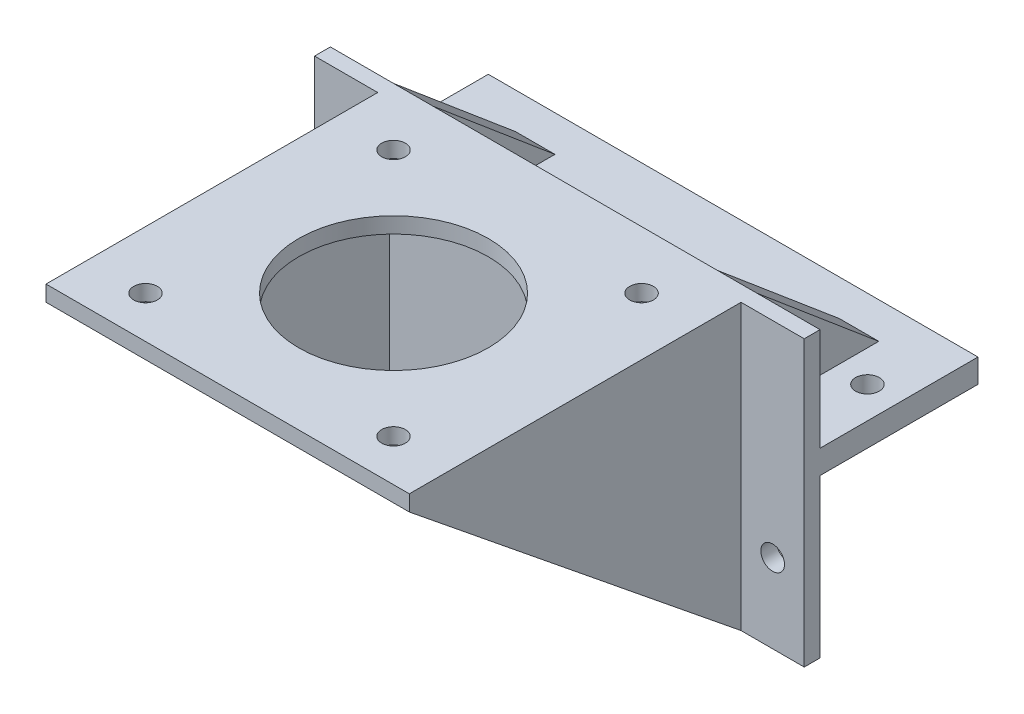
ISO-10303-21;
HEADER;
FILE_DESCRIPTION(('STEP AP214'),'2;1');
FILE_NAME('part.step','',(''),(''),'','','');
FILE_SCHEMA(('AUTOMOTIVE_DESIGN { 1 0 10303 214 1 1 1 1 }'));
ENDSEC;
DATA;
#1=APPLICATION_CONTEXT('core data for automotive mechanical design processes');
#2=APPLICATION_PROTOCOL_DEFINITION('international standard','automotive_design',2000,#1);
#3=PRODUCT_CONTEXT('',#1,'mechanical');
#4=PRODUCT('Part','Part','',(#3));
#5=PRODUCT_RELATED_PRODUCT_CATEGORY('part','',(#4));
#6=PRODUCT_DEFINITION_FORMATION('','',#4);
#7=PRODUCT_DEFINITION_CONTEXT('part definition',#1,'design');
#8=PRODUCT_DEFINITION('design','',#6,#7);
#9=PRODUCT_DEFINITION_SHAPE('','',#8);
#10=(LENGTH_UNIT() NAMED_UNIT(*) SI_UNIT(.MILLI.,.METRE.));
#11=(NAMED_UNIT(*) PLANE_ANGLE_UNIT() SI_UNIT($,.RADIAN.));
#12=(NAMED_UNIT(*) SI_UNIT($,.STERADIAN.) SOLID_ANGLE_UNIT());
#13=UNCERTAINTY_MEASURE_WITH_UNIT(LENGTH_MEASURE(1.E-05),#10,'distance_accuracy_value','');
#14=(GEOMETRIC_REPRESENTATION_CONTEXT(3) GLOBAL_UNCERTAINTY_ASSIGNED_CONTEXT((#13)) GLOBAL_UNIT_ASSIGNED_CONTEXT((#10,
#11,#12)) REPRESENTATION_CONTEXT('',''));
#15=CARTESIAN_POINT('',(0.,0.,0.));
#16=DIRECTION('',(0.,0.,1.));
#17=DIRECTION('',(1.,0.,0.));
#18=AXIS2_PLACEMENT_3D('',#15,#16,#17);
#19=CARTESIAN_POINT('',(-23.,19.,44.));
#20=DIRECTION('',(1.,0.,0.));
#21=DIRECTION('',(0.,0.,-1.));
#22=AXIS2_PLACEMENT_3D('',#19,#20,#21);
#23=PLANE('',#22);
#24=DIRECTION('',(0.,0.,-1.));
#25=VECTOR('',#24,1.);
#26=CARTESIAN_POINT('',(-23.,7.,44.));
#27=LINE('',#26,#25);
#28=CARTESIAN_POINT('',(-23.,7.,0.));
#29=VERTEX_POINT('',#28);
#30=CARTESIAN_POINT('',(-23.,7.,-15.4375));
#31=VERTEX_POINT('',#30);
#32=EDGE_CURVE('P0_E207',#29,#31,#27,.T.);
#33=ORIENTED_EDGE('',*,*,#32,.F.);
#34=DIRECTION('',(0.,-1.,0.));
#35=VECTOR('',#34,1.);
#36=CARTESIAN_POINT('',(-23.,12.,0.));
#37=LINE('',#36,#35);
#38=CARTESIAN_POINT('',(-23.,20.,0.));
#39=VERTEX_POINT('',#38);
#40=EDGE_CURVE('P0_E375',#39,#29,#37,.T.);
#41=ORIENTED_EDGE('',*,*,#40,.F.);
#42=DIRECTION('',(0.,0.64413574578278,0.764911198117051));
#43=VECTOR('',#42,1.);
#44=CARTESIAN_POINT('',(-23.,12.,-9.5));
#45=LINE('',#44,#43);
#46=EDGE_CURVE('P0_E268',#31,#39,#45,.T.);
#47=ORIENTED_EDGE('',*,*,#46,.F.);
#48=EDGE_LOOP('',(#33,#41,#47));
#49=FACE_BOUND('',#48,.T.);
#50=ADVANCED_FACE('P0_F38',(#49),#23,.F.);
#51=CARTESIAN_POINT('',(23.,19.,44.));
#52=DIRECTION('',(-1.,0.,0.));
#53=DIRECTION('',(0.,0.,1.));
#54=AXIS2_PLACEMENT_3D('',#51,#52,#53);
#55=PLANE('',#54);
#56=DIRECTION('',(0.,0.,1.));
#57=VECTOR('',#56,1.);
#58=CARTESIAN_POINT('',(23.,7.,44.));
#59=LINE('',#58,#57);
#60=CARTESIAN_POINT('',(23.,7.,-15.4375));
#61=VERTEX_POINT('',#60);
#62=CARTESIAN_POINT('',(23.,7.,0.));
#63=VERTEX_POINT('',#62);
#64=EDGE_CURVE('P0_E219',#61,#63,#59,.T.);
#65=ORIENTED_EDGE('',*,*,#64,.F.);
#66=DIRECTION('',(0.,0.64413574578278,0.764911198117051));
#67=VECTOR('',#66,1.);
#68=CARTESIAN_POINT('',(23.,12.,-9.5));
#69=LINE('',#68,#67);
#70=CARTESIAN_POINT('',(23.,20.,0.));
#71=VERTEX_POINT('',#70);
#72=EDGE_CURVE('P0_E261',#61,#71,#69,.T.);
#73=ORIENTED_EDGE('',*,*,#72,.T.);
#74=DIRECTION('',(0.,-1.,0.));
#75=VECTOR('',#74,1.);
#76=CARTESIAN_POINT('',(23.,12.,0.));
#77=LINE('',#76,#75);
#78=EDGE_CURVE('P0_E361',#71,#63,#77,.T.);
#79=ORIENTED_EDGE('',*,*,#78,.T.);
#80=EDGE_LOOP('',(#65,#73,#79));
#81=FACE_BOUND('',#80,.T.);
#82=ADVANCED_FACE('P0_F401',(#81),#55,.F.);
#83=CARTESIAN_POINT('',(0.,0.,0.));
#84=DIRECTION('',(0.,0.,1.));
#85=DIRECTION('',(1.,0.,0.));
#86=AXIS2_PLACEMENT_3D('',#83,#84,#85);
#87=PLANE('',#86);
#88=CARTESIAN_POINT('',(-27.,-6.000008,0.));
#89=DIRECTION('',(0.,0.,1.));
#90=DIRECTION('',(1.,0.,0.));
#91=AXIS2_PLACEMENT_3D('',#88,#89,#90);
#92=CIRCLE('',#91,1.5);
#93=CARTESIAN_POINT('',(-25.5,-6.000008,0.));
#94=VERTEX_POINT('',#93);
#95=EDGE_CURVE('P0_E46',#94,#94,#92,.T.);
#96=ORIENTED_EDGE('',*,*,#95,.T.);
#97=EDGE_LOOP('',(#96));
#98=FACE_BOUND('',#97,.T.);
#99=CARTESIAN_POINT('',(27.,-6.000008,0.));
#100=DIRECTION('',(0.,0.,1.));
#101=DIRECTION('',(1.,0.,0.));
#102=AXIS2_PLACEMENT_3D('',#99,#100,#101);
#103=CIRCLE('',#102,1.5);
#104=CARTESIAN_POINT('',(28.5,-6.000008,0.));
#105=VERTEX_POINT('',#104);
#106=EDGE_CURVE('P0_E378',#105,#105,#103,.T.);
#107=ORIENTED_EDGE('',*,*,#106,.T.);
#108=EDGE_LOOP('',(#107));
#109=FACE_BOUND('',#108,.T.);
#110=DIRECTION('',(1.,0.,0.));
#111=VECTOR('',#110,1.);
#112=CARTESIAN_POINT('',(18.,4.,0.));
#113=LINE('',#112,#111);
#114=CARTESIAN_POINT('',(-31.,4.,0.));
#115=VERTEX_POINT('',#114);
#116=CARTESIAN_POINT('',(31.,4.,0.));
#117=VERTEX_POINT('',#116);
#118=EDGE_CURVE('P0_E364',#115,#117,#113,.T.);
#119=ORIENTED_EDGE('',*,*,#118,.T.);
#120=DIRECTION('',(0.,-1.,0.));
#121=VECTOR('',#120,1.);
#122=CARTESIAN_POINT('',(31.,0.,0.));
#123=LINE('',#122,#121);
#124=CARTESIAN_POINT('',(31.,-16.000008,0.));
#125=VERTEX_POINT('',#124);
#126=EDGE_CURVE('P0_E205',#117,#125,#123,.T.);
#127=ORIENTED_EDGE('',*,*,#126,.T.);
#128=DIRECTION('',(-1.,0.,0.));
#129=VECTOR('',#128,1.);
#130=CARTESIAN_POINT('',(0.,-16.000008,0.));
#131=LINE('',#130,#129);
#132=CARTESIAN_POINT('',(-31.,-16.000008,0.));
#133=VERTEX_POINT('',#132);
#134=EDGE_CURVE('P0_E355',#125,#133,#131,.T.);
#135=ORIENTED_EDGE('',*,*,#134,.T.);
#136=DIRECTION('',(0.,-1.,0.));
#137=VECTOR('',#136,1.);
#138=CARTESIAN_POINT('',(-31.,0.,0.));
#139=LINE('',#138,#137);
#140=EDGE_CURVE('P0_E351',#115,#133,#139,.T.);
#141=ORIENTED_EDGE('',*,*,#140,.F.);
#142=EDGE_LOOP('',(#119,#127,#135,#141));
#143=FACE_BOUND('',#142,.T.);
#144=ADVANCED_FACE('P0_F40',(#98,#109,#143),#87,.F.);
#145=DIRECTION('',(1.,0.,0.));
#146=VECTOR('',#145,1.);
#147=CARTESIAN_POINT('',(31.,7.,0.));
#148=LINE('',#147,#146);
#149=CARTESIAN_POINT('',(-31.,7.,0.));
#150=VERTEX_POINT('',#149);
#151=EDGE_CURVE('P0_E201',#150,#29,#148,.T.);
#152=ORIENTED_EDGE('',*,*,#151,.F.);
#153=CARTESIAN_POINT('',(-31.,20.,0.));
#154=VERTEX_POINT('',#153);
#155=EDGE_CURVE('P0_E352',#154,#150,#139,.T.);
#156=ORIENTED_EDGE('',*,*,#155,.F.);
#157=DIRECTION('',(-1.,0.,0.));
#158=VECTOR('',#157,1.);
#159=CARTESIAN_POINT('',(-31.,20.,0.));
#160=LINE('',#159,#158);
#161=EDGE_CURVE('P0_E231',#39,#154,#160,.T.);
#162=ORIENTED_EDGE('',*,*,#161,.F.);
#163=ORIENTED_EDGE('',*,*,#40,.T.);
#164=EDGE_LOOP('',(#152,#156,#162,#163));
#165=FACE_BOUND('',#164,.T.);
#166=ADVANCED_FACE('P0_F503',(#165),#87,.F.);
#167=CARTESIAN_POINT('',(-18.,7.,0.));
#168=VERTEX_POINT('',#167);
#169=CARTESIAN_POINT('',(18.,7.,0.));
#170=VERTEX_POINT('',#169);
#171=EDGE_CURVE('P0_E509',#168,#170,#148,.T.);
#172=ORIENTED_EDGE('',*,*,#171,.F.);
#173=DIRECTION('',(0.,-1.,0.));
#174=VECTOR('',#173,1.);
#175=CARTESIAN_POINT('',(-18.,12.,0.));
#176=LINE('',#175,#174);
#177=CARTESIAN_POINT('',(-18.,20.,0.));
#178=VERTEX_POINT('',#177);
#179=EDGE_CURVE('P0_E372',#178,#168,#176,.T.);
#180=ORIENTED_EDGE('',*,*,#179,.F.);
#181=DIRECTION('',(-1.,0.,0.));
#182=VECTOR('',#181,1.);
#183=CARTESIAN_POINT('',(0.,20.,0.));
#184=LINE('',#183,#182);
#185=CARTESIAN_POINT('',(18.,20.,0.));
#186=VERTEX_POINT('',#185);
#187=EDGE_CURVE('P0_E369',#186,#178,#184,.T.);
#188=ORIENTED_EDGE('',*,*,#187,.F.);
#189=DIRECTION('',(0.,-1.,0.));
#190=VECTOR('',#189,1.);
#191=CARTESIAN_POINT('',(18.,12.,0.));
#192=LINE('',#191,#190);
#193=EDGE_CURVE('P0_E366',#186,#170,#192,.T.);
#194=ORIENTED_EDGE('',*,*,#193,.T.);
#195=EDGE_LOOP('',(#172,#180,#188,#194));
#196=FACE_BOUND('',#195,.T.);
#197=ADVANCED_FACE('P0_F494',(#196),#87,.F.);
#198=CARTESIAN_POINT('',(31.,7.,0.));
#199=VERTEX_POINT('',#198);
#200=EDGE_CURVE('P0_E480',#63,#199,#148,.T.);
#201=ORIENTED_EDGE('',*,*,#200,.F.);
#202=ORIENTED_EDGE('',*,*,#78,.F.);
#203=CARTESIAN_POINT('',(31.,20.,0.));
#204=VERTEX_POINT('',#203);
#205=EDGE_CURVE('P0_E232',#204,#71,#160,.T.);
#206=ORIENTED_EDGE('',*,*,#205,.F.);
#207=EDGE_CURVE('P0_E358',#204,#199,#123,.T.);
#208=ORIENTED_EDGE('',*,*,#207,.T.);
#209=EDGE_LOOP('',(#201,#202,#206,#208));
#210=FACE_BOUND('',#209,.T.);
#211=ADVANCED_FACE('P0_F478',(#210),#87,.F.);
#212=CARTESIAN_POINT('',(18.,12.,-9.5));
#213=DIRECTION('',(0.,0.764911198117051,-0.64413574578278));
#214=DIRECTION('',(0.,0.64413574578278,0.764911198117051));
#215=AXIS2_PLACEMENT_3D('',#212,#213,#214);
#216=PLANE('',#215);
#217=ORIENTED_EDGE('',*,*,#72,.F.);
#218=DIRECTION('',(-1.,0.,0.));
#219=VECTOR('',#218,1.);
#220=CARTESIAN_POINT('',(18.,7.,-15.4375));
#221=LINE('',#220,#219);
#222=CARTESIAN_POINT('',(18.,7.,-15.4375));
#223=VERTEX_POINT('',#222);
#224=EDGE_CURVE('P0_E216',#61,#223,#221,.T.);
#225=ORIENTED_EDGE('',*,*,#224,.T.);
#226=DIRECTION('',(0.,0.64413574578278,0.764911198117051));
#227=VECTOR('',#226,1.);
#228=CARTESIAN_POINT('',(18.,12.,-9.5));
#229=LINE('',#228,#227);
#230=EDGE_CURVE('P0_E237',#223,#186,#229,.T.);
#231=ORIENTED_EDGE('',*,*,#230,.T.);
#232=EDGE_CURVE('P0_E335',#71,#186,#184,.T.);
#233=ORIENTED_EDGE('',*,*,#232,.F.);
#234=EDGE_LOOP('',(#217,#225,#231,#233));
#235=FACE_BOUND('',#234,.T.);
#236=ADVANCED_FACE('P0_F486',(#235),#216,.T.);
#237=CARTESIAN_POINT('',(18.,12.,-9.5));
#238=DIRECTION('',(1.,0.,0.));
#239=DIRECTION('',(0.,1.,0.));
#240=AXIS2_PLACEMENT_3D('',#237,#238,#239);
#241=PLANE('',#240);
#242=DIRECTION('',(0.,0.,-1.));
#243=VECTOR('',#242,1.);
#244=CARTESIAN_POINT('',(18.,7.,-9.5));
#245=LINE('',#244,#243);
#246=EDGE_CURVE('P0_E214',#170,#223,#245,.T.);
#247=ORIENTED_EDGE('',*,*,#246,.F.);
#248=ORIENTED_EDGE('',*,*,#193,.F.);
#249=ORIENTED_EDGE('',*,*,#230,.F.);
#250=EDGE_LOOP('',(#247,#248,#249));
#251=FACE_BOUND('',#250,.T.);
#252=ADVANCED_FACE('P0_F557',(#251),#241,.F.);
#253=CARTESIAN_POINT('',(-18.,12.,-9.5));
#254=DIRECTION('',(0.,-0.764911198117051,0.64413574578278));
#255=DIRECTION('',(0.,-0.64413574578278,-0.764911198117051));
#256=AXIS2_PLACEMENT_3D('',#253,#254,#255);
#257=PLANE('',#256);
#258=DIRECTION('',(1.,0.,0.));
#259=VECTOR('',#258,1.);
#260=CARTESIAN_POINT('',(-18.,7.,-15.4375));
#261=LINE('',#260,#259);
#262=CARTESIAN_POINT('',(-18.,7.,-15.4375));
#263=VERTEX_POINT('',#262);
#264=EDGE_CURVE('P0_E53',#31,#263,#261,.T.);
#265=ORIENTED_EDGE('',*,*,#264,.F.);
#266=ORIENTED_EDGE('',*,*,#46,.T.);
#267=DIRECTION('',(-1.,0.,0.));
#268=VECTOR('',#267,1.);
#269=CARTESIAN_POINT('',(-18.,20.,0.));
#270=LINE('',#269,#268);
#271=EDGE_CURVE('P0_E332',#178,#39,#270,.T.);
#272=ORIENTED_EDGE('',*,*,#271,.F.);
#273=DIRECTION('',(0.,0.64413574578278,0.764911198117051));
#274=VECTOR('',#273,1.);
#275=CARTESIAN_POINT('',(-18.,12.,-9.5));
#276=LINE('',#275,#274);
#277=EDGE_CURVE('P0_E235',#263,#178,#276,.T.);
#278=ORIENTED_EDGE('',*,*,#277,.F.);
#279=EDGE_LOOP('',(#265,#266,#272,#278));
#280=FACE_BOUND('',#279,.T.);
#281=ADVANCED_FACE('P0_F422',(#280),#257,.F.);
#282=CARTESIAN_POINT('',(-18.,12.,-9.5));
#283=DIRECTION('',(1.,0.,0.));
#284=DIRECTION('',(0.,1.,0.));
#285=AXIS2_PLACEMENT_3D('',#282,#283,#284);
#286=PLANE('',#285);
#287=ORIENTED_EDGE('',*,*,#179,.T.);
#288=DIRECTION('',(0.,0.,-1.));
#289=VECTOR('',#288,1.);
#290=CARTESIAN_POINT('',(-18.,7.,-9.5));
#291=LINE('',#290,#289);
#292=EDGE_CURVE('P0_E11',#168,#263,#291,.T.);
#293=ORIENTED_EDGE('',*,*,#292,.T.);
#294=ORIENTED_EDGE('',*,*,#277,.T.);
#295=EDGE_LOOP('',(#287,#293,#294));
#296=FACE_BOUND('',#295,.T.);
#297=ADVANCED_FACE('P0_F414',(#296),#286,.T.);
#298=DIRECTION('',(0.,0.,-1.));
#299=VECTOR('',#298,1.);
#300=CARTESIAN_POINT('',(-23.,20.,44.));
#301=LINE('',#300,#299);
#302=CARTESIAN_POINT('',(-23.,20.,44.));
#303=VERTEX_POINT('',#302);
#304=CARTESIAN_POINT('',(-23.,20.,2.));
#305=VERTEX_POINT('',#304);
#306=EDGE_CURVE('P0_E330',#303,#305,#301,.T.);
#307=ORIENTED_EDGE('',*,*,#306,.T.);
#308=DIRECTION('',(0.,-1.,0.));
#309=VECTOR('',#308,1.);
#310=CARTESIAN_POINT('',(-23.,19.,2.));
#311=LINE('',#310,#309);
#312=CARTESIAN_POINT('',(-23.,-16.000008,2.));
#313=VERTEX_POINT('',#312);
#314=EDGE_CURVE('P0_E60',#305,#313,#311,.T.);
#315=ORIENTED_EDGE('',*,*,#314,.T.);
#316=DIRECTION('',(0.,-0.629198318104348,-0.777244798306595));
#317=VECTOR('',#316,1.);
#318=CARTESIAN_POINT('',(-23.,0.999996,23.));
#319=LINE('',#318,#317);
#320=CARTESIAN_POINT('',(-23.,18.,44.));
#321=VERTEX_POINT('',#320);
#322=EDGE_CURVE('P0_E266',#313,#321,#319,.F.);
#323=ORIENTED_EDGE('',*,*,#322,.T.);
#324=DIRECTION('',(0.,-1.,0.));
#325=VECTOR('',#324,1.);
#326=CARTESIAN_POINT('',(-23.,19.,44.));
#327=LINE('',#326,#325);
#328=EDGE_CURVE('P0_E263',#303,#321,#327,.T.);
#329=ORIENTED_EDGE('',*,*,#328,.F.);
#330=EDGE_LOOP('',(#307,#315,#323,#329));
#331=FACE_BOUND('',#330,.T.);
#332=ADVANCED_FACE('P0_F404',(#331),#23,.F.);
#333=DIRECTION('',(0.,1.,0.));
#334=VECTOR('',#333,1.);
#335=CARTESIAN_POINT('',(23.,19.,2.));
#336=LINE('',#335,#334);
#337=CARTESIAN_POINT('',(23.,-16.000008,2.));
#338=VERTEX_POINT('',#337);
#339=CARTESIAN_POINT('',(23.,20.,2.));
#340=VERTEX_POINT('',#339);
#341=EDGE_CURVE('P0_E313',#338,#340,#336,.T.);
#342=ORIENTED_EDGE('',*,*,#341,.T.);
#343=DIRECTION('',(0.,0.,-1.));
#344=VECTOR('',#343,1.);
#345=CARTESIAN_POINT('',(23.,20.,44.));
#346=LINE('',#345,#344);
#347=CARTESIAN_POINT('',(23.,20.,44.));
#348=VERTEX_POINT('',#347);
#349=EDGE_CURVE('P0_E324',#348,#340,#346,.T.);
#350=ORIENTED_EDGE('',*,*,#349,.F.);
#351=DIRECTION('',(0.,1.,0.));
#352=VECTOR('',#351,1.);
#353=CARTESIAN_POINT('',(23.,19.,44.));
#354=LINE('',#353,#352);
#355=CARTESIAN_POINT('',(23.,18.,44.));
#356=VERTEX_POINT('',#355);
#357=EDGE_CURVE('P0_E258',#356,#348,#354,.T.);
#358=ORIENTED_EDGE('',*,*,#357,.F.);
#359=DIRECTION('',(0.,-0.629198318104348,-0.777244798306595));
#360=VECTOR('',#359,1.);
#361=CARTESIAN_POINT('',(23.,0.999996,23.));
#362=LINE('',#361,#360);
#363=EDGE_CURVE('P0_E255',#338,#356,#362,.F.);
#364=ORIENTED_EDGE('',*,*,#363,.F.);
#365=EDGE_LOOP('',(#342,#350,#358,#364));
#366=FACE_BOUND('',#365,.T.);
#367=ADVANCED_FACE('P0_F410',(#366),#55,.F.);
#368=CARTESIAN_POINT('',(0.,20.,2.));
#369=DIRECTION('',(0.,-1.,0.));
#370=DIRECTION('',(0.,0.,-1.));
#371=AXIS2_PLACEMENT_3D('',#368,#369,#370);
#372=PLANE('',#371);
#373=ORIENTED_EDGE('',*,*,#271,.T.);
#374=ORIENTED_EDGE('',*,*,#161,.T.);
#375=DIRECTION('',(0.,0.,1.));
#376=VECTOR('',#375,1.);
#377=CARTESIAN_POINT('',(-31.,20.,0.));
#378=LINE('',#377,#376);
#379=CARTESIAN_POINT('',(-31.,20.,2.));
#380=VERTEX_POINT('',#379);
#381=EDGE_CURVE('P0_E221',#154,#380,#378,.T.);
#382=ORIENTED_EDGE('',*,*,#381,.T.);
#383=DIRECTION('',(1.,0.,0.));
#384=VECTOR('',#383,1.);
#385=CARTESIAN_POINT('',(-31.,20.,2.));
#386=LINE('',#385,#384);
#387=EDGE_CURVE('P0_E225',#380,#305,#386,.T.);
#388=ORIENTED_EDGE('',*,*,#387,.T.);
#389=ORIENTED_EDGE('',*,*,#306,.F.);
#390=DIRECTION('',(-1.,0.,0.));
#391=VECTOR('',#390,1.);
#392=CARTESIAN_POINT('',(0.,20.,44.));
#393=LINE('',#392,#391);
#394=EDGE_CURVE('P0_E327',#348,#303,#393,.T.);
#395=ORIENTED_EDGE('',*,*,#394,.F.);
#396=ORIENTED_EDGE('',*,*,#349,.T.);
#397=CARTESIAN_POINT('',(31.,20.,2.));
#398=VERTEX_POINT('',#397);
#399=EDGE_CURVE('P0_E224',#340,#398,#386,.T.);
#400=ORIENTED_EDGE('',*,*,#399,.T.);
#401=DIRECTION('',(0.,0.,-1.));
#402=VECTOR('',#401,1.);
#403=CARTESIAN_POINT('',(31.,20.,0.));
#404=LINE('',#403,#402);
#405=EDGE_CURVE('P0_E228',#398,#204,#404,.T.);
#406=ORIENTED_EDGE('',*,*,#405,.T.);
#407=ORIENTED_EDGE('',*,*,#205,.T.);
#408=ORIENTED_EDGE('',*,*,#232,.T.);
#409=ORIENTED_EDGE('',*,*,#187,.T.);
#410=EDGE_LOOP('',(#373,#374,#382,#388,#389,#395,#396,#400,#406,#407,#408,#409));
#411=FACE_BOUND('',#410,.T.);
#412=CARTESIAN_POINT('',(15.7,20.,7.3));
#413=DIRECTION('',(0.,-1.,0.));
#414=DIRECTION('',(0.,0.,-1.));
#415=AXIS2_PLACEMENT_3D('',#412,#413,#414);
#416=CIRCLE('',#415,1.5);
#417=CARTESIAN_POINT('',(15.7,20.,5.8));
#418=VERTEX_POINT('',#417);
#419=EDGE_CURVE('P0_E336',#418,#418,#416,.T.);
#420=ORIENTED_EDGE('',*,*,#419,.T.);
#421=EDGE_LOOP('',(#420));
#422=FACE_BOUND('',#421,.T.);
#423=CARTESIAN_POINT('',(-15.7,20.,7.3));
#424=DIRECTION('',(0.,-1.,0.));
#425=DIRECTION('',(0.,0.,-1.));
#426=AXIS2_PLACEMENT_3D('',#423,#424,#425);
#427=CIRCLE('',#426,1.5);
#428=CARTESIAN_POINT('',(-15.7,20.,5.8));
#429=VERTEX_POINT('',#428);
#430=EDGE_CURVE('P0_E339',#429,#429,#427,.T.);
#431=ORIENTED_EDGE('',*,*,#430,.T.);
#432=EDGE_LOOP('',(#431));
#433=FACE_BOUND('',#432,.T.);
#434=CARTESIAN_POINT('',(-15.7,20.,38.7));
#435=DIRECTION('',(0.,-1.,0.));
#436=DIRECTION('',(0.,0.,-1.));
#437=AXIS2_PLACEMENT_3D('',#434,#435,#436);
#438=CIRCLE('',#437,1.5);
#439=CARTESIAN_POINT('',(-15.7,20.,37.2));
#440=VERTEX_POINT('',#439);
#441=EDGE_CURVE('P0_E342',#440,#440,#438,.T.);
#442=ORIENTED_EDGE('',*,*,#441,.T.);
#443=EDGE_LOOP('',(#442));
#444=FACE_BOUND('',#443,.T.);
#445=CARTESIAN_POINT('',(15.7,20.,38.7));
#446=DIRECTION('',(0.,-1.,0.));
#447=DIRECTION('',(0.,0.,-1.));
#448=AXIS2_PLACEMENT_3D('',#445,#446,#447);
#449=CIRCLE('',#448,1.5);
#450=CARTESIAN_POINT('',(15.7,20.,37.2));
#451=VERTEX_POINT('',#450);
#452=EDGE_CURVE('P0_E345',#451,#451,#449,.T.);
#453=ORIENTED_EDGE('',*,*,#452,.T.);
#454=EDGE_LOOP('',(#453));
#455=FACE_BOUND('',#454,.T.);
#456=CARTESIAN_POINT('',(0.,20.,23.));
#457=DIRECTION('',(0.,-1.,0.));
#458=DIRECTION('',(0.,0.,-1.));
#459=AXIS2_PLACEMENT_3D('',#456,#457,#458);
#460=CIRCLE('',#459,12.);
#461=CARTESIAN_POINT('',(0.,20.,11.));
#462=VERTEX_POINT('',#461);
#463=EDGE_CURVE('P0_E348',#462,#462,#460,.T.);
#464=ORIENTED_EDGE('',*,*,#463,.T.);
#465=EDGE_LOOP('',(#464));
#466=FACE_BOUND('',#465,.T.);
#467=ADVANCED_FACE('P0_F420',(#411,#422,#433,#444,#455,#466),#372,.F.);
#468=CARTESIAN_POINT('',(0.,0.,2.));
#469=DIRECTION('',(0.,0.,1.));
#470=DIRECTION('',(1.,0.,0.));
#471=AXIS2_PLACEMENT_3D('',#468,#469,#470);
#472=PLANE('',#471);
#473=CARTESIAN_POINT('',(-27.,-6.000008,2.));
#474=DIRECTION('',(0.,0.,1.));
#475=DIRECTION('',(1.,0.,0.));
#476=AXIS2_PLACEMENT_3D('',#473,#474,#475);
#477=CIRCLE('',#476,1.5);
#478=CARTESIAN_POINT('',(-25.5,-6.000008,2.));
#479=VERTEX_POINT('',#478);
#480=EDGE_CURVE('P0_E321',#479,#479,#477,.T.);
#481=ORIENTED_EDGE('',*,*,#480,.F.);
#482=EDGE_LOOP('',(#481));
#483=FACE_BOUND('',#482,.T.);
#484=ORIENTED_EDGE('',*,*,#314,.F.);
#485=ORIENTED_EDGE('',*,*,#387,.F.);
#486=DIRECTION('',(0.,-1.,0.));
#487=VECTOR('',#486,1.);
#488=CARTESIAN_POINT('',(-31.,0.,2.));
#489=LINE('',#488,#487);
#490=CARTESIAN_POINT('',(-31.,-16.000008,2.));
#491=VERTEX_POINT('',#490);
#492=EDGE_CURVE('P0_E318',#380,#491,#489,.T.);
#493=ORIENTED_EDGE('',*,*,#492,.T.);
#494=DIRECTION('',(-1.,0.,0.));
#495=VECTOR('',#494,1.);
#496=CARTESIAN_POINT('',(0.,-16.000008,2.));
#497=LINE('',#496,#495);
#498=EDGE_CURVE('P0_E315',#313,#491,#497,.T.);
#499=ORIENTED_EDGE('',*,*,#498,.F.);
#500=EDGE_LOOP('',(#484,#485,#493,#499));
#501=FACE_BOUND('',#500,.T.);
#502=ADVANCED_FACE('P0_F430',(#483,#501),#472,.T.);
#503=DIRECTION('',(0.,-1.,0.));
#504=VECTOR('',#503,1.);
#505=CARTESIAN_POINT('',(31.,0.,2.));
#506=LINE('',#505,#504);
#507=CARTESIAN_POINT('',(31.,-16.000008,2.));
#508=VERTEX_POINT('',#507);
#509=EDGE_CURVE('P0_E309',#398,#508,#506,.T.);
#510=ORIENTED_EDGE('',*,*,#509,.F.);
#511=ORIENTED_EDGE('',*,*,#399,.F.);
#512=ORIENTED_EDGE('',*,*,#341,.F.);
#513=EDGE_CURVE('P0_E312',#508,#338,#497,.T.);
#514=ORIENTED_EDGE('',*,*,#513,.F.);
#515=EDGE_LOOP('',(#510,#511,#512,#514));
#516=FACE_BOUND('',#515,.T.);
#517=CARTESIAN_POINT('',(27.,-6.000008,2.));
#518=DIRECTION('',(0.,0.,1.));
#519=DIRECTION('',(1.,0.,0.));
#520=AXIS2_PLACEMENT_3D('',#517,#518,#519);
#521=CIRCLE('',#520,1.5);
#522=CARTESIAN_POINT('',(28.5,-6.000008,2.));
#523=VERTEX_POINT('',#522);
#524=EDGE_CURVE('P0_E306',#523,#523,#521,.T.);
#525=ORIENTED_EDGE('',*,*,#524,.F.);
#526=EDGE_LOOP('',(#525));
#527=FACE_BOUND('',#526,.T.);
#528=ADVANCED_FACE('P0_F471',(#516,#527),#472,.T.);
#529=CARTESIAN_POINT('',(0.,18.,44.));
#530=DIRECTION('',(0.,1.,0.));
#531=DIRECTION('',(-1.,0.,0.));
#532=AXIS2_PLACEMENT_3D('',#529,#530,#531);
#533=PLANE('',#532);
#534=CARTESIAN_POINT('',(0.,18.,23.));
#535=DIRECTION('',(0.,-1.,0.));
#536=DIRECTION('',(1.,0.,0.));
#537=AXIS2_PLACEMENT_3D('',#534,#535,#536);
#538=CIRCLE('',#537,12.);
#539=CARTESIAN_POINT('',(12.,18.,23.));
#540=VERTEX_POINT('',#539);
#541=EDGE_CURVE('P0_E303',#540,#540,#538,.T.);
#542=ORIENTED_EDGE('',*,*,#541,.F.);
#543=EDGE_LOOP('',(#542));
#544=FACE_BOUND('',#543,.T.);
#545=CARTESIAN_POINT('',(15.7,18.,38.7));
#546=DIRECTION('',(0.,-1.,0.));
#547=DIRECTION('',(1.,0.,0.));
#548=AXIS2_PLACEMENT_3D('',#545,#546,#547);
#549=CIRCLE('',#548,1.5);
#550=CARTESIAN_POINT('',(17.2,18.,38.7));
#551=VERTEX_POINT('',#550);
#552=EDGE_CURVE('P0_E300',#551,#551,#549,.T.);
#553=ORIENTED_EDGE('',*,*,#552,.F.);
#554=EDGE_LOOP('',(#553));
#555=FACE_BOUND('',#554,.T.);
#556=CARTESIAN_POINT('',(-15.7,18.,38.7));
#557=DIRECTION('',(0.,-1.,0.));
#558=DIRECTION('',(1.,0.,0.));
#559=AXIS2_PLACEMENT_3D('',#556,#557,#558);
#560=CIRCLE('',#559,1.5);
#561=CARTESIAN_POINT('',(-14.2,18.,38.7));
#562=VERTEX_POINT('',#561);
#563=EDGE_CURVE('P0_E297',#562,#562,#560,.T.);
#564=ORIENTED_EDGE('',*,*,#563,.F.);
#565=EDGE_LOOP('',(#564));
#566=FACE_BOUND('',#565,.T.);
#567=CARTESIAN_POINT('',(-15.7,18.,7.3));
#568=DIRECTION('',(0.,-1.,0.));
#569=DIRECTION('',(1.,0.,0.));
#570=AXIS2_PLACEMENT_3D('',#567,#568,#569);
#571=CIRCLE('',#570,1.5);
#572=CARTESIAN_POINT('',(-14.2,18.,7.3));
#573=VERTEX_POINT('',#572);
#574=EDGE_CURVE('P0_E294',#573,#573,#571,.T.);
#575=ORIENTED_EDGE('',*,*,#574,.F.);
#576=EDGE_LOOP('',(#575));
#577=FACE_BOUND('',#576,.T.);
#578=CARTESIAN_POINT('',(15.7,18.,7.3));
#579=DIRECTION('',(0.,-1.,0.));
#580=DIRECTION('',(1.,0.,0.));
#581=AXIS2_PLACEMENT_3D('',#578,#579,#580);
#582=CIRCLE('',#581,1.5);
#583=CARTESIAN_POINT('',(17.2,18.,7.3));
#584=VERTEX_POINT('',#583);
#585=EDGE_CURVE('P0_E291',#584,#584,#582,.T.);
#586=ORIENTED_EDGE('',*,*,#585,.F.);
#587=EDGE_LOOP('',(#586));
#588=FACE_BOUND('',#587,.T.);
#589=DIRECTION('',(0.,0.,-1.));
#590=VECTOR('',#589,1.);
#591=CARTESIAN_POINT('',(21.5,18.,44.));
#592=LINE('',#591,#590);
#593=CARTESIAN_POINT('',(21.5,18.,44.));
#594=VERTEX_POINT('',#593);
#595=CARTESIAN_POINT('',(21.5,18.,2.));
#596=VERTEX_POINT('',#595);
#597=EDGE_CURVE('P0_E288',#594,#596,#592,.T.);
#598=ORIENTED_EDGE('',*,*,#597,.F.);
#599=DIRECTION('',(1.,0.,0.));
#600=VECTOR('',#599,1.);
#601=CARTESIAN_POINT('',(0.,18.,44.));
#602=LINE('',#601,#600);
#603=CARTESIAN_POINT('',(-21.5,18.,44.));
#604=VERTEX_POINT('',#603);
#605=EDGE_CURVE('P0_E285',#604,#594,#602,.T.);
#606=ORIENTED_EDGE('',*,*,#605,.F.);
#607=DIRECTION('',(0.,0.,-1.));
#608=VECTOR('',#607,1.);
#609=CARTESIAN_POINT('',(-21.5,18.,44.));
#610=LINE('',#609,#608);
#611=CARTESIAN_POINT('',(-21.5,18.,2.));
#612=VERTEX_POINT('',#611);
#613=EDGE_CURVE('P0_E283',#604,#612,#610,.T.);
#614=ORIENTED_EDGE('',*,*,#613,.T.);
#615=DIRECTION('',(1.,0.,0.));
#616=VECTOR('',#615,1.);
#617=CARTESIAN_POINT('',(0.,18.,2.));
#618=LINE('',#617,#616);
#619=EDGE_CURVE('P0_E281',#612,#596,#618,.T.);
#620=ORIENTED_EDGE('',*,*,#619,.T.);
#621=EDGE_LOOP('',(#598,#606,#614,#620));
#622=FACE_BOUND('',#621,.T.);
#623=ADVANCED_FACE('P0_F464',(#544,#555,#566,#577,#588,#622),#533,.F.);
#624=DIRECTION('',(0.,-1.,0.));
#625=VECTOR('',#624,1.);
#626=CARTESIAN_POINT('',(21.5,0.999996,2.));
#627=LINE('',#626,#625);
#628=CARTESIAN_POINT('',(21.5,-16.000008,2.));
#629=VERTEX_POINT('',#628);
#630=EDGE_CURVE('P0_E278',#596,#629,#627,.T.);
#631=ORIENTED_EDGE('',*,*,#630,.F.);
#632=ORIENTED_EDGE('',*,*,#619,.F.);
#633=DIRECTION('',(0.,-1.,0.));
#634=VECTOR('',#633,1.);
#635=CARTESIAN_POINT('',(-21.5,0.999996,2.));
#636=LINE('',#635,#634);
#637=CARTESIAN_POINT('',(-21.5,-16.000008,2.));
#638=VERTEX_POINT('',#637);
#639=EDGE_CURVE('P0_E276',#612,#638,#636,.T.);
#640=ORIENTED_EDGE('',*,*,#639,.T.);
#641=EDGE_CURVE('P0_E275',#629,#638,#497,.T.);
#642=ORIENTED_EDGE('',*,*,#641,.F.);
#643=EDGE_LOOP('',(#631,#632,#640,#642));
#644=FACE_BOUND('',#643,.T.);
#645=ADVANCED_FACE('P0_F454',(#644),#472,.T.);
#646=CARTESIAN_POINT('',(31.,0.,2.));
#647=DIRECTION('',(1.,0.,0.));
#648=DIRECTION('',(0.,1.,0.));
#649=AXIS2_PLACEMENT_3D('',#646,#647,#648);
#650=PLANE('',#649);
#651=ORIENTED_EDGE('',*,*,#207,.F.);
#652=ORIENTED_EDGE('',*,*,#405,.F.);
#653=ORIENTED_EDGE('',*,*,#509,.T.);
#654=DIRECTION('',(0.,0.,-1.));
#655=VECTOR('',#654,1.);
#656=CARTESIAN_POINT('',(31.,-16.000008,2.));
#657=LINE('',#656,#655);
#658=EDGE_CURVE('P0_E273',#508,#125,#657,.T.);
#659=ORIENTED_EDGE('',*,*,#658,.T.);
#660=ORIENTED_EDGE('',*,*,#126,.F.);
#661=DIRECTION('',(0.,0.,1.));
#662=VECTOR('',#661,1.);
#663=CARTESIAN_POINT('',(31.,4.,-20.));
#664=LINE('',#663,#662);
#665=CARTESIAN_POINT('',(31.,4.,-20.));
#666=VERTEX_POINT('',#665);
#667=EDGE_CURVE('P0_E185',#666,#117,#664,.T.);
#668=ORIENTED_EDGE('',*,*,#667,.F.);
#669=DIRECTION('',(0.,-1.,0.));
#670=VECTOR('',#669,1.);
#671=CARTESIAN_POINT('',(31.,4.,-20.));
#672=LINE('',#671,#670);
#673=CARTESIAN_POINT('',(31.,7.,-20.));
#674=VERTEX_POINT('',#673);
#675=EDGE_CURVE('P0_E192',#674,#666,#672,.T.);
#676=ORIENTED_EDGE('',*,*,#675,.F.);
#677=DIRECTION('',(0.,0.,1.));
#678=VECTOR('',#677,1.);
#679=CARTESIAN_POINT('',(31.,7.,-20.));
#680=LINE('',#679,#678);
#681=EDGE_CURVE('P0_E475',#674,#199,#680,.T.);
#682=ORIENTED_EDGE('',*,*,#681,.T.);
#683=EDGE_LOOP('',(#651,#652,#653,#659,#660,#668,#676,#682));
#684=FACE_BOUND('',#683,.T.);
#685=ADVANCED_FACE('P0_F203',(#684),#650,.T.);
#686=CARTESIAN_POINT('',(-31.,0.,2.));
#687=DIRECTION('',(1.,0.,0.));
#688=DIRECTION('',(0.,1.,0.));
#689=AXIS2_PLACEMENT_3D('',#686,#687,#688);
#690=PLANE('',#689);
#691=ORIENTED_EDGE('',*,*,#492,.F.);
#692=ORIENTED_EDGE('',*,*,#381,.F.);
#693=ORIENTED_EDGE('',*,*,#155,.T.);
#694=DIRECTION('',(0.,0.,1.));
#695=VECTOR('',#694,1.);
#696=CARTESIAN_POINT('',(-31.,7.,-20.));
#697=LINE('',#696,#695);
#698=CARTESIAN_POINT('',(-31.,7.,-20.));
#699=VERTEX_POINT('',#698);
#700=EDGE_CURVE('P0_E209',#699,#150,#697,.T.);
#701=ORIENTED_EDGE('',*,*,#700,.F.);
#702=DIRECTION('',(0.,1.,0.));
#703=VECTOR('',#702,1.);
#704=CARTESIAN_POINT('',(-31.,4.,-20.));
#705=LINE('',#704,#703);
#706=CARTESIAN_POINT('',(-31.,4.,-20.));
#707=VERTEX_POINT('',#706);
#708=EDGE_CURVE('P0_E191',#707,#699,#705,.T.);
#709=ORIENTED_EDGE('',*,*,#708,.F.);
#710=DIRECTION('',(0.,0.,1.));
#711=VECTOR('',#710,1.);
#712=CARTESIAN_POINT('',(-31.,4.,-20.));
#713=LINE('',#712,#711);
#714=EDGE_CURVE('P0_E188',#707,#115,#713,.T.);
#715=ORIENTED_EDGE('',*,*,#714,.T.);
#716=ORIENTED_EDGE('',*,*,#140,.T.);
#717=DIRECTION('',(0.,0.,-1.));
#718=VECTOR('',#717,1.);
#719=CARTESIAN_POINT('',(-31.,-16.000008,2.));
#720=LINE('',#719,#718);
#721=EDGE_CURVE('P0_E270',#491,#133,#720,.T.);
#722=ORIENTED_EDGE('',*,*,#721,.F.);
#723=EDGE_LOOP('',(#691,#692,#693,#701,#709,#715,#716,#722));
#724=FACE_BOUND('',#723,.T.);
#725=ADVANCED_FACE('P0_F434',(#724),#690,.F.);
#726=CARTESIAN_POINT('',(0.,0.,44.));
#727=DIRECTION('',(0.,0.,1.));
#728=DIRECTION('',(1.,0.,0.));
#729=AXIS2_PLACEMENT_3D('',#726,#727,#728);
#730=PLANE('',#729);
#731=ORIENTED_EDGE('',*,*,#394,.T.);
#732=ORIENTED_EDGE('',*,*,#328,.T.);
#733=EDGE_CURVE('P0_E254',#321,#604,#602,.T.);
#734=ORIENTED_EDGE('',*,*,#733,.T.);
#735=ORIENTED_EDGE('',*,*,#605,.T.);
#736=DIRECTION('',(1.,0.,0.));
#737=VECTOR('',#736,1.);
#738=CARTESIAN_POINT('',(21.5,18.,44.));
#739=LINE('',#738,#737);
#740=EDGE_CURVE('P0_E251',#594,#356,#739,.T.);
#741=ORIENTED_EDGE('',*,*,#740,.T.);
#742=ORIENTED_EDGE('',*,*,#357,.T.);
#743=EDGE_LOOP('',(#731,#732,#734,#735,#741,#742));
#744=FACE_BOUND('',#743,.T.);
#745=ADVANCED_FACE('P0_F467',(#744),#730,.T.);
#746=CARTESIAN_POINT('',(0.,43.,23.));
#747=DIRECTION('',(0.,-1.,0.));
#748=DIRECTION('',(1.,0.,0.));
#749=AXIS2_PLACEMENT_3D('',#746,#747,#748);
#750=CYLINDRICAL_SURFACE('',#749,12.);
#751=ORIENTED_EDGE('',*,*,#541,.T.);
#752=EDGE_LOOP('',(#751));
#753=FACE_BOUND('',#752,.T.);
#754=ORIENTED_EDGE('',*,*,#463,.F.);
#755=EDGE_LOOP('',(#754));
#756=FACE_BOUND('',#755,.T.);
#757=ADVANCED_FACE('P0_F791',(#753,#756),#750,.F.);
#758=CARTESIAN_POINT('',(15.7,43.,38.7));
#759=DIRECTION('',(0.,-1.,0.));
#760=DIRECTION('',(1.,0.,0.));
#761=AXIS2_PLACEMENT_3D('',#758,#759,#760);
#762=CYLINDRICAL_SURFACE('',#761,1.5);
#763=ORIENTED_EDGE('',*,*,#552,.T.);
#764=EDGE_LOOP('',(#763));
#765=FACE_BOUND('',#764,.T.);
#766=ORIENTED_EDGE('',*,*,#452,.F.);
#767=EDGE_LOOP('',(#766));
#768=FACE_BOUND('',#767,.T.);
#769=ADVANCED_FACE('P0_F782',(#765,#768),#762,.F.);
#770=CARTESIAN_POINT('',(-15.7,43.,38.7));
#771=DIRECTION('',(0.,-1.,0.));
#772=DIRECTION('',(1.,0.,0.));
#773=AXIS2_PLACEMENT_3D('',#770,#771,#772);
#774=CYLINDRICAL_SURFACE('',#773,1.5);
#775=ORIENTED_EDGE('',*,*,#563,.T.);
#776=EDGE_LOOP('',(#775));
#777=FACE_BOUND('',#776,.T.);
#778=ORIENTED_EDGE('',*,*,#441,.F.);
#779=EDGE_LOOP('',(#778));
#780=FACE_BOUND('',#779,.T.);
#781=ADVANCED_FACE('P0_F773',(#777,#780),#774,.F.);
#782=CARTESIAN_POINT('',(-15.7,43.,7.3));
#783=DIRECTION('',(0.,-1.,0.));
#784=DIRECTION('',(1.,0.,0.));
#785=AXIS2_PLACEMENT_3D('',#782,#783,#784);
#786=CYLINDRICAL_SURFACE('',#785,1.5);
#787=ORIENTED_EDGE('',*,*,#574,.T.);
#788=EDGE_LOOP('',(#787));
#789=FACE_BOUND('',#788,.T.);
#790=ORIENTED_EDGE('',*,*,#430,.F.);
#791=EDGE_LOOP('',(#790));
#792=FACE_BOUND('',#791,.T.);
#793=ADVANCED_FACE('P0_F764',(#789,#792),#786,.F.);
#794=CARTESIAN_POINT('',(15.7,43.,7.3));
#795=DIRECTION('',(0.,-1.,0.));
#796=DIRECTION('',(1.,0.,0.));
#797=AXIS2_PLACEMENT_3D('',#794,#795,#796);
#798=CYLINDRICAL_SURFACE('',#797,1.5);
#799=ORIENTED_EDGE('',*,*,#585,.T.);
#800=EDGE_LOOP('',(#799));
#801=FACE_BOUND('',#800,.T.);
#802=ORIENTED_EDGE('',*,*,#419,.F.);
#803=EDGE_LOOP('',(#802));
#804=FACE_BOUND('',#803,.T.);
#805=ADVANCED_FACE('P0_F756',(#801,#804),#798,.F.);
#806=CARTESIAN_POINT('',(0.,-16.000008,2.));
#807=DIRECTION('',(0.,-1.,0.));
#808=DIRECTION('',(0.,0.,-1.));
#809=AXIS2_PLACEMENT_3D('',#806,#807,#808);
#810=PLANE('',#809);
#811=ORIENTED_EDGE('',*,*,#134,.F.);
#812=ORIENTED_EDGE('',*,*,#658,.F.);
#813=ORIENTED_EDGE('',*,*,#513,.T.);
#814=DIRECTION('',(1.,0.,0.));
#815=VECTOR('',#814,1.);
#816=CARTESIAN_POINT('',(21.5,-16.000008,2.));
#817=LINE('',#816,#815);
#818=EDGE_CURVE('P0_E248',#629,#338,#817,.T.);
#819=ORIENTED_EDGE('',*,*,#818,.F.);
#820=ORIENTED_EDGE('',*,*,#641,.T.);
#821=DIRECTION('',(-1.,0.,0.));
#822=VECTOR('',#821,1.);
#823=CARTESIAN_POINT('',(-21.5,-16.000008,2.));
#824=LINE('',#823,#822);
#825=EDGE_CURVE('P0_E245',#638,#313,#824,.T.);
#826=ORIENTED_EDGE('',*,*,#825,.T.);
#827=ORIENTED_EDGE('',*,*,#498,.T.);
#828=ORIENTED_EDGE('',*,*,#721,.T.);
#829=EDGE_LOOP('',(#811,#812,#813,#819,#820,#826,#827,#828));
#830=FACE_BOUND('',#829,.T.);
#831=ADVANCED_FACE('P0_F438',(#830),#810,.T.);
#832=CARTESIAN_POINT('',(-21.5,0.999996,23.));
#833=DIRECTION('',(0.,-0.777244798306595,0.629198318104348));
#834=DIRECTION('',(0.,-0.629198318104348,-0.777244798306595));
#835=AXIS2_PLACEMENT_3D('',#832,#833,#834);
#836=PLANE('',#835);
#837=ORIENTED_EDGE('',*,*,#322,.F.);
#838=ORIENTED_EDGE('',*,*,#825,.F.);
#839=DIRECTION('',(0.,-0.629198318104348,-0.777244798306595));
#840=VECTOR('',#839,1.);
#841=CARTESIAN_POINT('',(-21.5,0.999996,23.));
#842=LINE('',#841,#840);
#843=EDGE_CURVE('P0_E242',#638,#604,#842,.F.);
#844=ORIENTED_EDGE('',*,*,#843,.T.);
#845=ORIENTED_EDGE('',*,*,#733,.F.);
#846=EDGE_LOOP('',(#837,#838,#844,#845));
#847=FACE_BOUND('',#846,.T.);
#848=ADVANCED_FACE('P0_F458',(#847),#836,.T.);
#849=CARTESIAN_POINT('',(-21.5,9.499998,12.5));
#850=DIRECTION('',(1.,0.,0.));
#851=DIRECTION('',(0.,0.,-1.));
#852=AXIS2_PLACEMENT_3D('',#849,#850,#851);
#853=PLANE('',#852);
#854=ORIENTED_EDGE('',*,*,#843,.F.);
#855=ORIENTED_EDGE('',*,*,#639,.F.);
#856=ORIENTED_EDGE('',*,*,#613,.F.);
#857=EDGE_LOOP('',(#854,#855,#856));
#858=FACE_BOUND('',#857,.T.);
#859=ADVANCED_FACE('P0_F462',(#858),#853,.T.);
#860=CARTESIAN_POINT('',(21.5,0.999996,23.));
#861=DIRECTION('',(0.,0.777244798306595,-0.629198318104348));
#862=DIRECTION('',(0.,0.629198318104348,0.777244798306595));
#863=AXIS2_PLACEMENT_3D('',#860,#861,#862);
#864=PLANE('',#863);
#865=ORIENTED_EDGE('',*,*,#363,.T.);
#866=ORIENTED_EDGE('',*,*,#740,.F.);
#867=DIRECTION('',(0.,-0.629198318104348,-0.777244798306595));
#868=VECTOR('',#867,1.);
#869=CARTESIAN_POINT('',(21.5,0.999996,23.));
#870=LINE('',#869,#868);
#871=EDGE_CURVE('P0_E239',#629,#594,#870,.F.);
#872=ORIENTED_EDGE('',*,*,#871,.F.);
#873=ORIENTED_EDGE('',*,*,#818,.T.);
#874=EDGE_LOOP('',(#865,#866,#872,#873));
#875=FACE_BOUND('',#874,.T.);
#876=ADVANCED_FACE('P0_F447',(#875),#864,.F.);
#877=CARTESIAN_POINT('',(21.5,9.499998,12.5));
#878=DIRECTION('',(1.,0.,0.));
#879=DIRECTION('',(0.,0.,-1.));
#880=AXIS2_PLACEMENT_3D('',#877,#878,#879);
#881=PLANE('',#880);
#882=ORIENTED_EDGE('',*,*,#871,.T.);
#883=ORIENTED_EDGE('',*,*,#597,.T.);
#884=ORIENTED_EDGE('',*,*,#630,.T.);
#885=EDGE_LOOP('',(#882,#883,#884));
#886=FACE_BOUND('',#885,.T.);
#887=ADVANCED_FACE('P0_F397',(#886),#881,.F.);
#888=CARTESIAN_POINT('',(27.,-6.000008,-23.));
#889=DIRECTION('',(0.,0.,1.));
#890=DIRECTION('',(1.,0.,0.));
#891=AXIS2_PLACEMENT_3D('',#888,#889,#890);
#892=CYLINDRICAL_SURFACE('',#891,1.5);
#893=ORIENTED_EDGE('',*,*,#524,.T.);
#894=EDGE_LOOP('',(#893));
#895=FACE_BOUND('',#894,.T.);
#896=ORIENTED_EDGE('',*,*,#106,.F.);
#897=EDGE_LOOP('',(#896));
#898=FACE_BOUND('',#897,.T.);
#899=ADVANCED_FACE('P0_F387',(#895,#898),#892,.F.);
#900=CARTESIAN_POINT('',(-27.,-6.000008,-23.));
#901=DIRECTION('',(0.,0.,1.));
#902=DIRECTION('',(1.,0.,0.));
#903=AXIS2_PLACEMENT_3D('',#900,#901,#902);
#904=CYLINDRICAL_SURFACE('',#903,1.5);
#905=ORIENTED_EDGE('',*,*,#480,.T.);
#906=EDGE_LOOP('',(#905));
#907=FACE_BOUND('',#906,.T.);
#908=ORIENTED_EDGE('',*,*,#95,.F.);
#909=EDGE_LOOP('',(#908));
#910=FACE_BOUND('',#909,.T.);
#911=ADVANCED_FACE('P0_F385',(#907,#910),#904,.F.);
#912=CARTESIAN_POINT('',(18.,4.,-9.5));
#913=DIRECTION('',(0.,-1.,0.));
#914=DIRECTION('',(0.,0.,-1.));
#915=AXIS2_PLACEMENT_3D('',#912,#913,#914);
#916=PLANE('',#915);
#917=CARTESIAN_POINT('',(27.,4.,-10.));
#918=DIRECTION('',(0.,-1.,0.));
#919=DIRECTION('',(0.,0.,-1.));
#920=AXIS2_PLACEMENT_3D('',#917,#918,#919);
#921=CIRCLE('',#920,1.5);
#922=CARTESIAN_POINT('',(27.,4.,-11.5));
#923=VERTEX_POINT('',#922);
#924=EDGE_CURVE('P0_E510',#923,#923,#921,.T.);
#925=ORIENTED_EDGE('',*,*,#924,.F.);
#926=EDGE_LOOP('',(#925));
#927=FACE_BOUND('',#926,.T.);
#928=CARTESIAN_POINT('',(0.,4.,-10.));
#929=DIRECTION('',(0.,-1.,0.));
#930=DIRECTION('',(0.,0.,-1.));
#931=AXIS2_PLACEMENT_3D('',#928,#929,#930);
#932=CIRCLE('',#931,1.5);
#933=CARTESIAN_POINT('',(0.,4.,-11.5));
#934=VERTEX_POINT('',#933);
#935=EDGE_CURVE('P0_E512',#934,#934,#932,.T.);
#936=ORIENTED_EDGE('',*,*,#935,.F.);
#937=EDGE_LOOP('',(#936));
#938=FACE_BOUND('',#937,.T.);
#939=CARTESIAN_POINT('',(-27.,4.,-10.));
#940=DIRECTION('',(0.,-1.,0.));
#941=DIRECTION('',(0.,0.,-1.));
#942=AXIS2_PLACEMENT_3D('',#939,#940,#941);
#943=CIRCLE('',#942,1.5);
#944=CARTESIAN_POINT('',(-27.,4.,-11.5));
#945=VERTEX_POINT('',#944);
#946=EDGE_CURVE('P0_E517',#945,#945,#943,.T.);
#947=ORIENTED_EDGE('',*,*,#946,.F.);
#948=EDGE_LOOP('',(#947));
#949=FACE_BOUND('',#948,.T.);
#950=ORIENTED_EDGE('',*,*,#667,.T.);
#951=ORIENTED_EDGE('',*,*,#118,.F.);
#952=ORIENTED_EDGE('',*,*,#714,.F.);
#953=DIRECTION('',(-1.,0.,0.));
#954=VECTOR('',#953,1.);
#955=CARTESIAN_POINT('',(31.,4.,-20.));
#956=LINE('',#955,#954);
#957=EDGE_CURVE('P0_E181',#666,#707,#956,.T.);
#958=ORIENTED_EDGE('',*,*,#957,.F.);
#959=EDGE_LOOP('',(#950,#951,#952,#958));
#960=FACE_BOUND('',#959,.T.);
#961=ADVANCED_FACE('P0_F183',(#927,#938,#949,#960),#916,.T.);
#962=CARTESIAN_POINT('',(31.,7.,-20.));
#963=DIRECTION('',(0.,-1.,0.));
#964=DIRECTION('',(0.,0.,-1.));
#965=AXIS2_PLACEMENT_3D('',#962,#963,#964);
#966=PLANE('',#965);
#967=CARTESIAN_POINT('',(27.,7.,-10.));
#968=DIRECTION('',(0.,1.,0.));
#969=DIRECTION('',(0.,0.,1.));
#970=AXIS2_PLACEMENT_3D('',#967,#968,#969);
#971=CIRCLE('',#970,1.5);
#972=CARTESIAN_POINT('',(27.,7.,-8.5));
#973=VERTEX_POINT('',#972);
#974=EDGE_CURVE('P0_E522',#973,#973,#971,.T.);
#975=ORIENTED_EDGE('',*,*,#974,.F.);
#976=EDGE_LOOP('',(#975));
#977=FACE_BOUND('',#976,.T.);
#978=CARTESIAN_POINT('',(0.,7.,-10.));
#979=DIRECTION('',(0.,1.,0.));
#980=DIRECTION('',(0.,0.,1.));
#981=AXIS2_PLACEMENT_3D('',#978,#979,#980);
#982=CIRCLE('',#981,1.5);
#983=CARTESIAN_POINT('',(0.,7.,-8.5));
#984=VERTEX_POINT('',#983);
#985=EDGE_CURVE('P0_E526',#984,#984,#982,.T.);
#986=ORIENTED_EDGE('',*,*,#985,.F.);
#987=EDGE_LOOP('',(#986));
#988=FACE_BOUND('',#987,.T.);
#989=CARTESIAN_POINT('',(-27.,7.,-10.));
#990=DIRECTION('',(0.,1.,0.));
#991=DIRECTION('',(0.,0.,1.));
#992=AXIS2_PLACEMENT_3D('',#989,#990,#991);
#993=CIRCLE('',#992,1.5);
#994=CARTESIAN_POINT('',(-27.,7.,-8.5));
#995=VERTEX_POINT('',#994);
#996=EDGE_CURVE('P0_E523',#995,#995,#993,.T.);
#997=ORIENTED_EDGE('',*,*,#996,.F.);
#998=EDGE_LOOP('',(#997));
#999=FACE_BOUND('',#998,.T.);
#1000=ORIENTED_EDGE('',*,*,#224,.F.);
#1001=ORIENTED_EDGE('',*,*,#64,.T.);
#1002=ORIENTED_EDGE('',*,*,#200,.T.);
#1003=ORIENTED_EDGE('',*,*,#681,.F.);
#1004=DIRECTION('',(1.,0.,0.));
#1005=VECTOR('',#1004,1.);
#1006=CARTESIAN_POINT('',(31.,7.,-20.));
#1007=LINE('',#1006,#1005);
#1008=EDGE_CURVE('P0_E197',#699,#674,#1007,.T.);
#1009=ORIENTED_EDGE('',*,*,#1008,.F.);
#1010=ORIENTED_EDGE('',*,*,#700,.T.);
#1011=ORIENTED_EDGE('',*,*,#151,.T.);
#1012=ORIENTED_EDGE('',*,*,#32,.T.);
#1013=ORIENTED_EDGE('',*,*,#264,.T.);
#1014=ORIENTED_EDGE('',*,*,#292,.F.);
#1015=ORIENTED_EDGE('',*,*,#171,.T.);
#1016=ORIENTED_EDGE('',*,*,#246,.T.);
#1017=EDGE_LOOP('',(#1000,#1001,#1002,#1003,#1009,#1010,#1011,#1012,#1013,#1014,#1015,#1016));
#1018=FACE_BOUND('',#1017,.T.);
#1019=ADVANCED_FACE('P0_F394',(#977,#988,#999,#1018),#966,.F.);
#1020=CARTESIAN_POINT('',(0.,0.,-20.));
#1021=DIRECTION('',(0.,0.,1.));
#1022=DIRECTION('',(1.,0.,0.));
#1023=AXIS2_PLACEMENT_3D('',#1020,#1021,#1022);
#1024=PLANE('',#1023);
#1025=ORIENTED_EDGE('',*,*,#675,.T.);
#1026=ORIENTED_EDGE('',*,*,#957,.T.);
#1027=ORIENTED_EDGE('',*,*,#708,.T.);
#1028=ORIENTED_EDGE('',*,*,#1008,.T.);
#1029=EDGE_LOOP('',(#1025,#1026,#1027,#1028));
#1030=FACE_BOUND('',#1029,.T.);
#1031=ADVANCED_FACE('P0_F195',(#1030),#1024,.F.);
#1032=CARTESIAN_POINT('',(-27.,-13.,-10.));
#1033=DIRECTION('',(0.,1.,0.));
#1034=DIRECTION('',(0.,0.,1.));
#1035=AXIS2_PLACEMENT_3D('',#1032,#1033,#1034);
#1036=CYLINDRICAL_SURFACE('',#1035,1.5);
#1037=ORIENTED_EDGE('',*,*,#946,.T.);
#1038=EDGE_LOOP('',(#1037));
#1039=FACE_BOUND('',#1038,.T.);
#1040=ORIENTED_EDGE('',*,*,#996,.T.);
#1041=EDGE_LOOP('',(#1040));
#1042=FACE_BOUND('',#1041,.T.);
#1043=ADVANCED_FACE('P0_F541',(#1039,#1042),#1036,.F.);
#1044=CARTESIAN_POINT('',(0.,-13.,-10.));
#1045=DIRECTION('',(0.,1.,0.));
#1046=DIRECTION('',(0.,0.,1.));
#1047=AXIS2_PLACEMENT_3D('',#1044,#1045,#1046);
#1048=CYLINDRICAL_SURFACE('',#1047,1.5);
#1049=ORIENTED_EDGE('',*,*,#935,.T.);
#1050=EDGE_LOOP('',(#1049));
#1051=FACE_BOUND('',#1050,.T.);
#1052=ORIENTED_EDGE('',*,*,#985,.T.);
#1053=EDGE_LOOP('',(#1052));
#1054=FACE_BOUND('',#1053,.T.);
#1055=ADVANCED_FACE('P0_F543',(#1051,#1054),#1048,.F.);
#1056=CARTESIAN_POINT('',(27.,-13.,-10.));
#1057=DIRECTION('',(0.,1.,0.));
#1058=DIRECTION('',(0.,0.,1.));
#1059=AXIS2_PLACEMENT_3D('',#1056,#1057,#1058);
#1060=CYLINDRICAL_SURFACE('',#1059,1.5);
#1061=ORIENTED_EDGE('',*,*,#924,.T.);
#1062=EDGE_LOOP('',(#1061));
#1063=FACE_BOUND('',#1062,.T.);
#1064=ORIENTED_EDGE('',*,*,#974,.T.);
#1065=EDGE_LOOP('',(#1064));
#1066=FACE_BOUND('',#1065,.T.);
#1067=ADVANCED_FACE('P0_F532',(#1063,#1066),#1060,.F.);
#1068=CLOSED_SHELL('',(#50,#82,#144,#166,#197,#211,#236,#252,#281,#297,#332,#367,#467,#502,#528,
#623,#645,#685,#725,#745,#757,#769,#781,#793,#805,#831,#848,#859,#876,#887,#899,#911,#961,#1019,
#1031,#1043,#1055,#1067));
#1069=MANIFOLD_SOLID_BREP('P0_B2',#1068);
#1070=CARTESIAN_POINT('',(-23.,9.499998,12.5));
#1071=DIRECTION('',(1.,0.,0.));
#1072=DIRECTION('',(0.,0.,-1.));
#1073=AXIS2_PLACEMENT_3D('',#1070,#1071,#1072);
#1074=PLANE('',#1073);
#1075=DIRECTION('',(0.,-0.629198318104348,-0.777244798306595));
#1076=VECTOR('',#1075,1.);
#1077=CARTESIAN_POINT('',(-23.,0.999996,23.));
#1078=LINE('',#1077,#1076);
#1079=CARTESIAN_POINT('',(-23.,-16.000008,2.));
#1080=VERTEX_POINT('',#1079);
#1081=CARTESIAN_POINT('',(-23.,18.,44.));
#1082=VERTEX_POINT('',#1081);
#1083=EDGE_CURVE('P1_E11',#1080,#1082,#1078,.F.);
#1084=ORIENTED_EDGE('',*,*,#1083,.T.);
#1085=DIRECTION('',(0.,0.,-1.));
#1086=VECTOR('',#1085,1.);
#1087=CARTESIAN_POINT('',(-23.,18.,44.));
#1088=LINE('',#1087,#1086);
#1089=CARTESIAN_POINT('',(-23.,18.,2.));
#1090=VERTEX_POINT('',#1089);
#1091=EDGE_CURVE('P1_E20',#1082,#1090,#1088,.T.);
#1092=ORIENTED_EDGE('',*,*,#1091,.T.);
#1093=DIRECTION('',(0.,-1.,0.));
#1094=VECTOR('',#1093,1.);
#1095=CARTESIAN_POINT('',(-23.,0.999996,2.));
#1096=LINE('',#1095,#1094);
#1097=EDGE_CURVE('P1_E30',#1090,#1080,#1096,.T.);
#1098=ORIENTED_EDGE('',*,*,#1097,.T.);
#1099=EDGE_LOOP('',(#1084,#1092,#1098));
#1100=FACE_BOUND('',#1099,.T.);
#1101=ADVANCED_FACE('P1_F16',(#1100),#1074,.F.);
#1102=OPEN_SHELL('',(#1101));
#1103=SHELL_BASED_SURFACE_MODEL('P1_B1',(#1102));
#1104=CARTESIAN_POINT('',(23.,9.499998,12.5));
#1105=DIRECTION('',(1.,0.,0.));
#1106=DIRECTION('',(0.,0.,-1.));
#1107=AXIS2_PLACEMENT_3D('',#1104,#1105,#1106);
#1108=PLANE('',#1107);
#1109=DIRECTION('',(0.,-0.629198318104348,-0.777244798306595));
#1110=VECTOR('',#1109,1.);
#1111=CARTESIAN_POINT('',(23.,0.999996,23.));
#1112=LINE('',#1111,#1110);
#1113=CARTESIAN_POINT('',(23.,-16.000008,2.));
#1114=VERTEX_POINT('',#1113);
#1115=CARTESIAN_POINT('',(23.,18.,44.));
#1116=VERTEX_POINT('',#1115);
#1117=EDGE_CURVE('P2_E11',#1114,#1116,#1112,.F.);
#1118=ORIENTED_EDGE('',*,*,#1117,.T.);
#1119=DIRECTION('',(0.,0.,-1.));
#1120=VECTOR('',#1119,1.);
#1121=CARTESIAN_POINT('',(23.,18.,44.));
#1122=LINE('',#1121,#1120);
#1123=CARTESIAN_POINT('',(23.,18.,2.));
#1124=VERTEX_POINT('',#1123);
#1125=EDGE_CURVE('P2_E20',#1116,#1124,#1122,.T.);
#1126=ORIENTED_EDGE('',*,*,#1125,.T.);
#1127=DIRECTION('',(0.,-1.,0.));
#1128=VECTOR('',#1127,1.);
#1129=CARTESIAN_POINT('',(23.,0.999996,2.));
#1130=LINE('',#1129,#1128);
#1131=EDGE_CURVE('P2_E30',#1124,#1114,#1130,.T.);
#1132=ORIENTED_EDGE('',*,*,#1131,.T.);
#1133=EDGE_LOOP('',(#1118,#1126,#1132));
#1134=FACE_BOUND('',#1133,.T.);
#1135=ADVANCED_FACE('P2_F16',(#1134),#1108,.F.);
#1136=OPEN_SHELL('',(#1135));
#1137=SHELL_BASED_SURFACE_MODEL('P2_B1',(#1136));
#1138=ADVANCED_BREP_SHAPE_REPRESENTATION('',(#18,#1069),#14);
#1139=MANIFOLD_SURFACE_SHAPE_REPRESENTATION('',(#18,#1103,#1137),#14);
#1140=SHAPE_REPRESENTATION('',(#18),#14);
#1141=SHAPE_DEFINITION_REPRESENTATION(#9,#1140);
#1142=SHAPE_REPRESENTATION_RELATIONSHIP('','',#1140,#1138);
#1143=SHAPE_REPRESENTATION_RELATIONSHIP('','',#1140,#1139);
ENDSEC;
END-ISO-10303-21;
